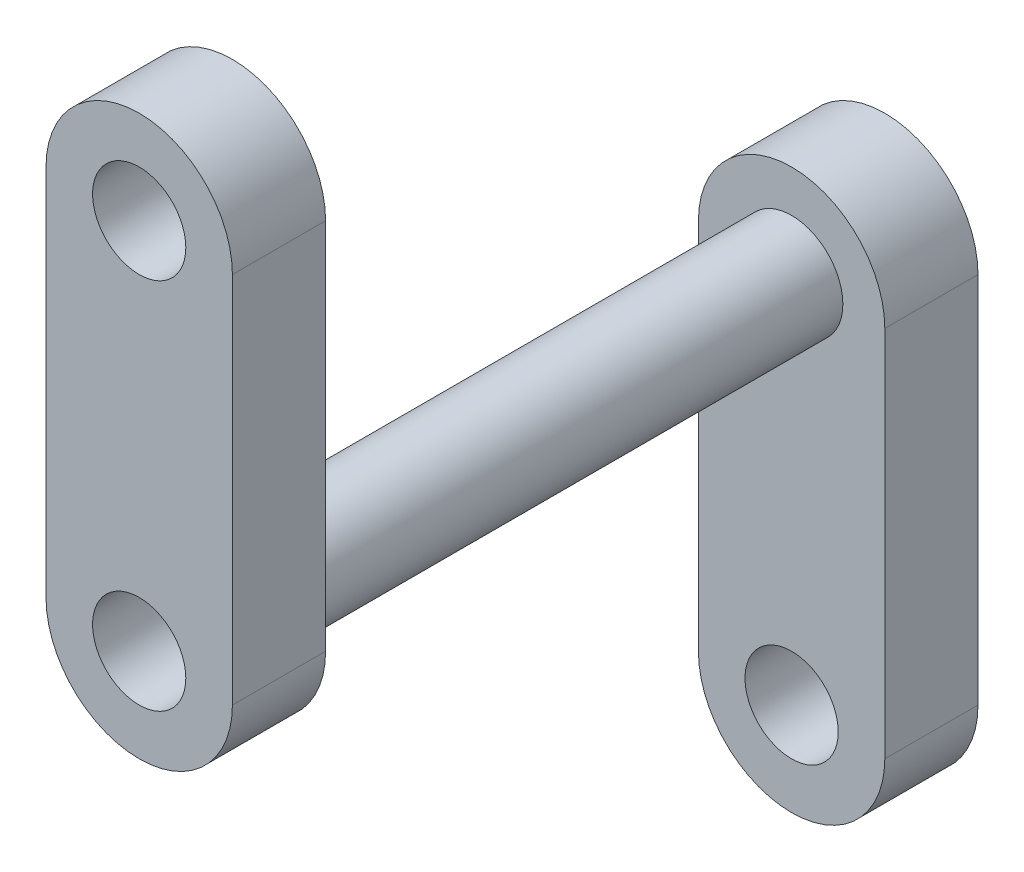
ISO-10303-21;
HEADER;
FILE_DESCRIPTION(('STEP AP214'),'2;1');
FILE_NAME('part.step','',(''),(''),'','','');
FILE_SCHEMA(('AUTOMOTIVE_DESIGN { 1 0 10303 214 1 1 1 1 }'));
ENDSEC;
DATA;
#1=APPLICATION_CONTEXT('core data for automotive mechanical design processes');
#2=APPLICATION_PROTOCOL_DEFINITION('international standard','automotive_design',2000,#1);
#3=PRODUCT_CONTEXT('',#1,'mechanical');
#4=PRODUCT('Part','Part','',(#3));
#5=PRODUCT_RELATED_PRODUCT_CATEGORY('part','',(#4));
#6=PRODUCT_DEFINITION_FORMATION('','',#4);
#7=PRODUCT_DEFINITION_CONTEXT('part definition',#1,'design');
#8=PRODUCT_DEFINITION('design','',#6,#7);
#9=PRODUCT_DEFINITION_SHAPE('','',#8);
#10=(LENGTH_UNIT() NAMED_UNIT(*) SI_UNIT(.MILLI.,.METRE.));
#11=(NAMED_UNIT(*) PLANE_ANGLE_UNIT() SI_UNIT($,.RADIAN.));
#12=(NAMED_UNIT(*) SI_UNIT($,.STERADIAN.) SOLID_ANGLE_UNIT());
#13=UNCERTAINTY_MEASURE_WITH_UNIT(LENGTH_MEASURE(1.E-05),#10,'distance_accuracy_value','');
#14=(GEOMETRIC_REPRESENTATION_CONTEXT(3) GLOBAL_UNCERTAINTY_ASSIGNED_CONTEXT((#13)) GLOBAL_UNIT_ASSIGNED_CONTEXT((#10,
#11,#12)) REPRESENTATION_CONTEXT('',''));
#15=CARTESIAN_POINT('',(0.,0.,0.));
#16=DIRECTION('',(0.,0.,1.));
#17=DIRECTION('',(1.,0.,0.));
#18=AXIS2_PLACEMENT_3D('',#15,#16,#17);
#19=CARTESIAN_POINT('',(10.,50.,80.));
#20=DIRECTION('',(0.,0.,-1.));
#21=DIRECTION('',(-1.,0.,0.));
#22=AXIS2_PLACEMENT_3D('',#19,#20,#21);
#23=CYLINDRICAL_SURFACE('',#22,5.5);
#24=CARTESIAN_POINT('',(10.,50.,10.));
#25=DIRECTION('',(0.,0.,1.));
#26=DIRECTION('',(1.,0.,0.));
#27=AXIS2_PLACEMENT_3D('',#24,#25,#26);
#28=CIRCLE('',#27,5.5);
#29=CARTESIAN_POINT('',(15.5,50.,10.));
#30=VERTEX_POINT('',#29);
#31=EDGE_CURVE('E161',#30,#30,#28,.T.);
#32=ORIENTED_EDGE('',*,*,#31,.T.);
#33=EDGE_LOOP('',(#32));
#34=FACE_BOUND('',#33,.T.);
#35=CARTESIAN_POINT('',(10.,50.,70.));
#36=DIRECTION('',(0.,0.,1.));
#37=DIRECTION('',(1.,0.,0.));
#38=AXIS2_PLACEMENT_3D('',#35,#36,#37);
#39=CIRCLE('',#38,5.5);
#40=CARTESIAN_POINT('',(15.5,50.,70.));
#41=VERTEX_POINT('',#40);
#42=EDGE_CURVE('E11',#41,#41,#39,.T.);
#43=ORIENTED_EDGE('',*,*,#42,.F.);
#44=EDGE_LOOP('',(#43));
#45=FACE_BOUND('',#44,.T.);
#46=ADVANCED_FACE('F35',(#34,#45),#23,.T.);
#47=CARTESIAN_POINT('',(0.,0.,10.));
#48=DIRECTION('',(-1.,0.,0.));
#49=DIRECTION('',(0.,-1.,0.));
#50=AXIS2_PLACEMENT_3D('',#47,#48,#49);
#51=PLANE('',#50);
#52=DIRECTION('',(0.,1.,0.));
#53=VECTOR('',#52,1.);
#54=CARTESIAN_POINT('',(0.,0.,0.));
#55=LINE('',#54,#53);
#56=CARTESIAN_POINT('',(0.,10.,0.));
#57=VERTEX_POINT('',#56);
#58=CARTESIAN_POINT('',(0.,50.,0.));
#59=VERTEX_POINT('',#58);
#60=EDGE_CURVE('E177',#57,#59,#55,.T.);
#61=ORIENTED_EDGE('',*,*,#60,.F.);
#62=DIRECTION('',(0.,0.,-1.));
#63=VECTOR('',#62,1.);
#64=CARTESIAN_POINT('',(0.,10.,10.));
#65=LINE('',#64,#63);
#66=CARTESIAN_POINT('',(0.,10.,10.));
#67=VERTEX_POINT('',#66);
#68=EDGE_CURVE('E44',#67,#57,#65,.T.);
#69=ORIENTED_EDGE('',*,*,#68,.F.);
#70=DIRECTION('',(0.,1.,0.));
#71=VECTOR('',#70,1.);
#72=CARTESIAN_POINT('',(0.,0.,10.));
#73=LINE('',#72,#71);
#74=CARTESIAN_POINT('',(0.,50.,10.));
#75=VERTEX_POINT('',#74);
#76=EDGE_CURVE('E167',#67,#75,#73,.T.);
#77=ORIENTED_EDGE('',*,*,#76,.T.);
#78=DIRECTION('',(0.,0.,-1.));
#79=VECTOR('',#78,1.);
#80=CARTESIAN_POINT('',(0.,50.,10.));
#81=LINE('',#80,#79);
#82=EDGE_CURVE('E76',#75,#59,#81,.T.);
#83=ORIENTED_EDGE('',*,*,#82,.T.);
#84=EDGE_LOOP('',(#61,#69,#77,#83));
#85=FACE_BOUND('',#84,.T.);
#86=ADVANCED_FACE('F197',(#85),#51,.T.);
#87=CARTESIAN_POINT('',(10.,10.,10.));
#88=DIRECTION('',(0.,0.,-1.));
#89=DIRECTION('',(-1.,0.,0.));
#90=AXIS2_PLACEMENT_3D('',#87,#88,#89);
#91=CYLINDRICAL_SURFACE('',#90,10.);
#92=CARTESIAN_POINT('',(10.,10.,0.));
#93=DIRECTION('',(0.,0.,1.));
#94=DIRECTION('',(1.,0.,0.));
#95=AXIS2_PLACEMENT_3D('',#92,#93,#94);
#96=CIRCLE('',#95,10.);
#97=CARTESIAN_POINT('',(20.,10.,0.));
#98=VERTEX_POINT('',#97);
#99=EDGE_CURVE('E179',#57,#98,#96,.T.);
#100=ORIENTED_EDGE('',*,*,#99,.T.);
#101=DIRECTION('',(0.,0.,-1.));
#102=VECTOR('',#101,1.);
#103=CARTESIAN_POINT('',(20.,10.,10.));
#104=LINE('',#103,#102);
#105=CARTESIAN_POINT('',(20.,10.,10.));
#106=VERTEX_POINT('',#105);
#107=EDGE_CURVE('E189',#106,#98,#104,.T.);
#108=ORIENTED_EDGE('',*,*,#107,.F.);
#109=CARTESIAN_POINT('',(10.,10.,10.));
#110=DIRECTION('',(0.,0.,1.));
#111=DIRECTION('',(1.,0.,0.));
#112=AXIS2_PLACEMENT_3D('',#109,#110,#111);
#113=CIRCLE('',#112,10.);
#114=EDGE_CURVE('E169',#67,#106,#113,.T.);
#115=ORIENTED_EDGE('',*,*,#114,.F.);
#116=ORIENTED_EDGE('',*,*,#68,.T.);
#117=EDGE_LOOP('',(#100,#108,#115,#116));
#118=FACE_BOUND('',#117,.T.);
#119=ADVANCED_FACE('F193',(#118),#91,.T.);
#120=CARTESIAN_POINT('',(20.,0.,10.));
#121=DIRECTION('',(-1.,0.,0.));
#122=DIRECTION('',(0.,-1.,0.));
#123=AXIS2_PLACEMENT_3D('',#120,#121,#122);
#124=PLANE('',#123);
#125=DIRECTION('',(0.,1.,0.));
#126=VECTOR('',#125,1.);
#127=CARTESIAN_POINT('',(20.,0.,0.));
#128=LINE('',#127,#126);
#129=CARTESIAN_POINT('',(20.,50.,0.));
#130=VERTEX_POINT('',#129);
#131=EDGE_CURVE('E182',#98,#130,#128,.T.);
#132=ORIENTED_EDGE('',*,*,#131,.T.);
#133=DIRECTION('',(0.,0.,-1.));
#134=VECTOR('',#133,1.);
#135=CARTESIAN_POINT('',(20.,50.,10.));
#136=LINE('',#135,#134);
#137=CARTESIAN_POINT('',(20.,50.,10.));
#138=VERTEX_POINT('',#137);
#139=EDGE_CURVE('E187',#138,#130,#136,.T.);
#140=ORIENTED_EDGE('',*,*,#139,.F.);
#141=DIRECTION('',(0.,1.,0.));
#142=VECTOR('',#141,1.);
#143=CARTESIAN_POINT('',(20.,0.,10.));
#144=LINE('',#143,#142);
#145=EDGE_CURVE('E172',#106,#138,#144,.T.);
#146=ORIENTED_EDGE('',*,*,#145,.F.);
#147=ORIENTED_EDGE('',*,*,#107,.T.);
#148=EDGE_LOOP('',(#132,#140,#146,#147));
#149=FACE_BOUND('',#148,.T.);
#150=ADVANCED_FACE('F203',(#149),#124,.F.);
#151=CARTESIAN_POINT('',(10.,10.,10.));
#152=DIRECTION('',(0.,0.,-1.));
#153=DIRECTION('',(-1.,0.,0.));
#154=AXIS2_PLACEMENT_3D('',#151,#152,#153);
#155=CYLINDRICAL_SURFACE('',#154,5.);
#156=CARTESIAN_POINT('',(10.,10.,10.));
#157=DIRECTION('',(0.,0.,1.));
#158=DIRECTION('',(1.,0.,0.));
#159=AXIS2_PLACEMENT_3D('',#156,#157,#158);
#160=CIRCLE('',#159,5.);
#161=CARTESIAN_POINT('',(15.,10.,10.));
#162=VERTEX_POINT('',#161);
#163=EDGE_CURVE('E164',#162,#162,#160,.T.);
#164=ORIENTED_EDGE('',*,*,#163,.T.);
#165=EDGE_LOOP('',(#164));
#166=FACE_BOUND('',#165,.T.);
#167=CARTESIAN_POINT('',(10.,10.,0.));
#168=DIRECTION('',(0.,0.,1.));
#169=DIRECTION('',(1.,0.,0.));
#170=AXIS2_PLACEMENT_3D('',#167,#168,#169);
#171=CIRCLE('',#170,5.);
#172=CARTESIAN_POINT('',(15.,10.,0.));
#173=VERTEX_POINT('',#172);
#174=EDGE_CURVE('E158',#173,#173,#171,.T.);
#175=ORIENTED_EDGE('',*,*,#174,.F.);
#176=EDGE_LOOP('',(#175));
#177=FACE_BOUND('',#176,.T.);
#178=ADVANCED_FACE('F37',(#166,#177),#155,.F.);
#179=CARTESIAN_POINT('',(10.,50.,10.));
#180=DIRECTION('',(0.,0.,-1.));
#181=DIRECTION('',(-1.,0.,0.));
#182=AXIS2_PLACEMENT_3D('',#179,#180,#181);
#183=CYLINDRICAL_SURFACE('',#182,10.);
#184=CARTESIAN_POINT('',(10.,50.,0.));
#185=DIRECTION('',(0.,0.,1.));
#186=DIRECTION('',(1.,0.,0.));
#187=AXIS2_PLACEMENT_3D('',#184,#185,#186);
#188=CIRCLE('',#187,10.);
#189=EDGE_CURVE('E69',#130,#59,#188,.T.);
#190=ORIENTED_EDGE('',*,*,#189,.T.);
#191=ORIENTED_EDGE('',*,*,#82,.F.);
#192=CARTESIAN_POINT('',(10.,50.,10.));
#193=DIRECTION('',(0.,0.,1.));
#194=DIRECTION('',(1.,0.,0.));
#195=AXIS2_PLACEMENT_3D('',#192,#193,#194);
#196=CIRCLE('',#195,10.);
#197=EDGE_CURVE('E52',#138,#75,#196,.T.);
#198=ORIENTED_EDGE('',*,*,#197,.F.);
#199=ORIENTED_EDGE('',*,*,#139,.T.);
#200=EDGE_LOOP('',(#190,#191,#198,#199));
#201=FACE_BOUND('',#200,.T.);
#202=ADVANCED_FACE('F211',(#201),#183,.T.);
#203=CARTESIAN_POINT('',(0.,0.,10.));
#204=DIRECTION('',(0.,0.,1.));
#205=DIRECTION('',(1.,0.,0.));
#206=AXIS2_PLACEMENT_3D('',#203,#204,#205);
#207=PLANE('',#206);
#208=ORIENTED_EDGE('',*,*,#31,.F.);
#209=EDGE_LOOP('',(#208));
#210=FACE_BOUND('',#209,.T.);
#211=ORIENTED_EDGE('',*,*,#163,.F.);
#212=EDGE_LOOP('',(#211));
#213=FACE_BOUND('',#212,.T.);
#214=ORIENTED_EDGE('',*,*,#76,.F.);
#215=ORIENTED_EDGE('',*,*,#114,.T.);
#216=ORIENTED_EDGE('',*,*,#145,.T.);
#217=ORIENTED_EDGE('',*,*,#197,.T.);
#218=EDGE_LOOP('',(#214,#215,#216,#217));
#219=FACE_BOUND('',#218,.T.);
#220=ADVANCED_FACE('F214',(#210,#213,#219),#207,.T.);
#221=CARTESIAN_POINT('',(0.,0.,0.));
#222=DIRECTION('',(0.,0.,1.));
#223=DIRECTION('',(1.,0.,0.));
#224=AXIS2_PLACEMENT_3D('',#221,#222,#223);
#225=PLANE('',#224);
#226=ORIENTED_EDGE('',*,*,#174,.T.);
#227=EDGE_LOOP('',(#226));
#228=FACE_BOUND('',#227,.T.);
#229=ORIENTED_EDGE('',*,*,#60,.T.);
#230=ORIENTED_EDGE('',*,*,#189,.F.);
#231=ORIENTED_EDGE('',*,*,#131,.F.);
#232=ORIENTED_EDGE('',*,*,#99,.F.);
#233=EDGE_LOOP('',(#229,#230,#231,#232));
#234=FACE_BOUND('',#233,.T.);
#235=CARTESIAN_POINT('',(10.,50.,0.));
#236=DIRECTION('',(0.,0.,1.));
#237=DIRECTION('',(1.,0.,0.));
#238=AXIS2_PLACEMENT_3D('',#235,#236,#237);
#239=CIRCLE('',#238,5.);
#240=CARTESIAN_POINT('',(15.,50.,0.));
#241=VERTEX_POINT('',#240);
#242=EDGE_CURVE('E151',#241,#241,#239,.T.);
#243=ORIENTED_EDGE('',*,*,#242,.T.);
#244=EDGE_LOOP('',(#243));
#245=FACE_BOUND('',#244,.T.);
#246=ADVANCED_FACE('F195',(#228,#234,#245),#225,.F.);
#247=CARTESIAN_POINT('',(10.,50.,80.));
#248=DIRECTION('',(0.,0.,-1.));
#249=DIRECTION('',(-1.,0.,0.));
#250=AXIS2_PLACEMENT_3D('',#247,#248,#249);
#251=CYLINDRICAL_SURFACE('',#250,5.);
#252=CARTESIAN_POINT('',(10.,50.,80.));
#253=DIRECTION('',(0.,0.,1.));
#254=DIRECTION('',(1.,0.,0.));
#255=AXIS2_PLACEMENT_3D('',#252,#253,#254);
#256=CIRCLE('',#255,5.);
#257=CARTESIAN_POINT('',(15.,50.,80.));
#258=VERTEX_POINT('',#257);
#259=EDGE_CURVE('E155',#258,#258,#256,.T.);
#260=ORIENTED_EDGE('',*,*,#259,.T.);
#261=EDGE_LOOP('',(#260));
#262=FACE_BOUND('',#261,.T.);
#263=ORIENTED_EDGE('',*,*,#242,.F.);
#264=EDGE_LOOP('',(#263));
#265=FACE_BOUND('',#264,.T.);
#266=ADVANCED_FACE('F218',(#262,#265),#251,.F.);
#267=CARTESIAN_POINT('',(0.,0.,80.));
#268=DIRECTION('',(0.,0.,1.));
#269=DIRECTION('',(1.,0.,0.));
#270=AXIS2_PLACEMENT_3D('',#267,#268,#269);
#271=PLANE('',#270);
#272=ORIENTED_EDGE('',*,*,#259,.F.);
#273=EDGE_LOOP('',(#272));
#274=FACE_BOUND('',#273,.T.);
#275=CARTESIAN_POINT('',(9.99999999999972,90.,80.));
#276=DIRECTION('',(0.,0.,1.));
#277=DIRECTION('',(1.,0.,0.));
#278=AXIS2_PLACEMENT_3D('',#275,#276,#277);
#279=CIRCLE('',#278,5.00000000000001);
#280=CARTESIAN_POINT('',(14.9999999999997,90.,80.));
#281=VERTEX_POINT('',#280);
#282=EDGE_CURVE('E138',#281,#281,#279,.T.);
#283=ORIENTED_EDGE('',*,*,#282,.F.);
#284=EDGE_LOOP('',(#283));
#285=FACE_BOUND('',#284,.T.);
#286=DIRECTION('',(0.,-1.,0.));
#287=VECTOR('',#286,1.);
#288=CARTESIAN_POINT('',(20.0000000000004,1.40512601554124E-13,80.));
#289=LINE('',#288,#287);
#290=CARTESIAN_POINT('',(19.9999999999997,90.0000000000001,80.));
#291=VERTEX_POINT('',#290);
#292=CARTESIAN_POINT('',(20.,50.0000000000001,80.));
#293=VERTEX_POINT('',#292);
#294=EDGE_CURVE('E141',#291,#293,#289,.T.);
#295=ORIENTED_EDGE('',*,*,#294,.F.);
#296=CARTESIAN_POINT('',(9.99999999999972,90.,80.));
#297=DIRECTION('',(0.,0.,1.));
#298=DIRECTION('',(1.,0.,0.));
#299=AXIS2_PLACEMENT_3D('',#296,#297,#298);
#300=CIRCLE('',#299,10.);
#301=CARTESIAN_POINT('',(-2.80157841370254E-13,89.9999999999999,80.));
#302=VERTEX_POINT('',#301);
#303=EDGE_CURVE('E113',#291,#302,#300,.T.);
#304=ORIENTED_EDGE('',*,*,#303,.T.);
#305=DIRECTION('',(0.,-1.,0.));
#306=VECTOR('',#305,1.);
#307=CARTESIAN_POINT('',(3.365363543395E-13,0.,80.));
#308=LINE('',#307,#306);
#309=CARTESIAN_POINT('',(0.,49.9999999999999,80.));
#310=VERTEX_POINT('',#309);
#311=EDGE_CURVE('E144',#302,#310,#308,.T.);
#312=ORIENTED_EDGE('',*,*,#311,.T.);
#313=CARTESIAN_POINT('',(10.,50.,80.));
#314=DIRECTION('',(0.,0.,1.));
#315=DIRECTION('',(1.,0.,0.));
#316=AXIS2_PLACEMENT_3D('',#313,#314,#315);
#317=CIRCLE('',#316,10.);
#318=EDGE_CURVE('E147',#310,#293,#317,.T.);
#319=ORIENTED_EDGE('',*,*,#318,.T.);
#320=EDGE_LOOP('',(#295,#304,#312,#319));
#321=FACE_BOUND('',#320,.T.);
#322=ADVANCED_FACE('F224',(#274,#285,#321),#271,.T.);
#323=CARTESIAN_POINT('',(20.0000000000004,1.40512601554124E-13,70.));
#324=DIRECTION('',(-1.,0.,0.));
#325=DIRECTION('',(0.,-1.,0.));
#326=AXIS2_PLACEMENT_3D('',#323,#324,#325);
#327=PLANE('',#326);
#328=ORIENTED_EDGE('',*,*,#294,.T.);
#329=DIRECTION('',(0.,0.,1.));
#330=VECTOR('',#329,1.);
#331=CARTESIAN_POINT('',(20.,50.0000000000001,70.));
#332=LINE('',#331,#330);
#333=CARTESIAN_POINT('',(20.,50.0000000000001,70.));
#334=VERTEX_POINT('',#333);
#335=EDGE_CURVE('E123',#334,#293,#332,.T.);
#336=ORIENTED_EDGE('',*,*,#335,.F.);
#337=DIRECTION('',(0.,-1.,0.));
#338=VECTOR('',#337,1.);
#339=CARTESIAN_POINT('',(20.0000000000004,1.40512601554124E-13,70.));
#340=LINE('',#339,#338);
#341=CARTESIAN_POINT('',(19.9999999999997,90.0000000000001,70.));
#342=VERTEX_POINT('',#341);
#343=EDGE_CURVE('E121',#342,#334,#340,.T.);
#344=ORIENTED_EDGE('',*,*,#343,.F.);
#345=DIRECTION('',(0.,0.,1.));
#346=VECTOR('',#345,1.);
#347=CARTESIAN_POINT('',(19.9999999999997,90.0000000000001,70.));
#348=LINE('',#347,#346);
#349=EDGE_CURVE('E107',#342,#291,#348,.T.);
#350=ORIENTED_EDGE('',*,*,#349,.T.);
#351=EDGE_LOOP('',(#328,#336,#344,#350));
#352=FACE_BOUND('',#351,.T.);
#353=ADVANCED_FACE('F122',(#352),#327,.F.);
#354=CARTESIAN_POINT('',(10.,50.,70.));
#355=DIRECTION('',(0.,0.,1.));
#356=DIRECTION('',(1.,0.,0.));
#357=AXIS2_PLACEMENT_3D('',#354,#355,#356);
#358=CYLINDRICAL_SURFACE('',#357,10.);
#359=ORIENTED_EDGE('',*,*,#318,.F.);
#360=DIRECTION('',(0.,0.,1.));
#361=VECTOR('',#360,1.);
#362=CARTESIAN_POINT('',(0.,49.9999999999999,70.));
#363=LINE('',#362,#361);
#364=CARTESIAN_POINT('',(0.,49.9999999999999,70.));
#365=VERTEX_POINT('',#364);
#366=EDGE_CURVE('E152',#365,#310,#363,.T.);
#367=ORIENTED_EDGE('',*,*,#366,.F.);
#368=CARTESIAN_POINT('',(10.,50.,70.));
#369=DIRECTION('',(0.,0.,1.));
#370=DIRECTION('',(1.,0.,0.));
#371=AXIS2_PLACEMENT_3D('',#368,#369,#370);
#372=CIRCLE('',#371,10.);
#373=EDGE_CURVE('E118',#365,#334,#372,.T.);
#374=ORIENTED_EDGE('',*,*,#373,.T.);
#375=ORIENTED_EDGE('',*,*,#335,.T.);
#376=EDGE_LOOP('',(#359,#367,#374,#375));
#377=FACE_BOUND('',#376,.T.);
#378=ADVANCED_FACE('F237',(#377),#358,.T.);
#379=CARTESIAN_POINT('',(3.365363543395E-13,0.,70.));
#380=DIRECTION('',(-1.,0.,0.));
#381=DIRECTION('',(0.,-1.,0.));
#382=AXIS2_PLACEMENT_3D('',#379,#380,#381);
#383=PLANE('',#382);
#384=ORIENTED_EDGE('',*,*,#311,.F.);
#385=DIRECTION('',(0.,0.,1.));
#386=VECTOR('',#385,1.);
#387=CARTESIAN_POINT('',(-2.80157841370254E-13,89.9999999999999,70.));
#388=LINE('',#387,#386);
#389=CARTESIAN_POINT('',(-2.80157841370254E-13,89.9999999999999,70.));
#390=VERTEX_POINT('',#389);
#391=EDGE_CURVE('E117',#390,#302,#388,.T.);
#392=ORIENTED_EDGE('',*,*,#391,.F.);
#393=DIRECTION('',(0.,-1.,0.));
#394=VECTOR('',#393,1.);
#395=CARTESIAN_POINT('',(3.365363543395E-13,0.,70.));
#396=LINE('',#395,#394);
#397=EDGE_CURVE('E132',#390,#365,#396,.T.);
#398=ORIENTED_EDGE('',*,*,#397,.T.);
#399=ORIENTED_EDGE('',*,*,#366,.T.);
#400=EDGE_LOOP('',(#384,#392,#398,#399));
#401=FACE_BOUND('',#400,.T.);
#402=ADVANCED_FACE('F233',(#401),#383,.T.);
#403=CARTESIAN_POINT('',(9.99999999999972,90.,70.));
#404=DIRECTION('',(0.,0.,1.));
#405=DIRECTION('',(1.,0.,0.));
#406=AXIS2_PLACEMENT_3D('',#403,#404,#405);
#407=CYLINDRICAL_SURFACE('',#406,5.00000000000001);
#408=CARTESIAN_POINT('',(9.99999999999972,90.,70.));
#409=DIRECTION('',(0.,0.,1.));
#410=DIRECTION('',(1.,0.,0.));
#411=AXIS2_PLACEMENT_3D('',#408,#409,#410);
#412=CIRCLE('',#411,5.00000000000001);
#413=CARTESIAN_POINT('',(14.9999999999997,90.,70.));
#414=VERTEX_POINT('',#413);
#415=EDGE_CURVE('E127',#414,#414,#412,.T.);
#416=ORIENTED_EDGE('',*,*,#415,.F.);
#417=EDGE_LOOP('',(#416));
#418=FACE_BOUND('',#417,.T.);
#419=ORIENTED_EDGE('',*,*,#282,.T.);
#420=EDGE_LOOP('',(#419));
#421=FACE_BOUND('',#420,.T.);
#422=ADVANCED_FACE('F230',(#418,#421),#407,.F.);
#423=CARTESIAN_POINT('',(9.99999999999972,90.,70.));
#424=DIRECTION('',(0.,0.,1.));
#425=DIRECTION('',(1.,0.,0.));
#426=AXIS2_PLACEMENT_3D('',#423,#424,#425);
#427=CYLINDRICAL_SURFACE('',#426,10.);
#428=ORIENTED_EDGE('',*,*,#303,.F.);
#429=ORIENTED_EDGE('',*,*,#349,.F.);
#430=CARTESIAN_POINT('',(9.99999999999972,90.,70.));
#431=DIRECTION('',(0.,0.,1.));
#432=DIRECTION('',(1.,0.,0.));
#433=AXIS2_PLACEMENT_3D('',#430,#431,#432);
#434=CIRCLE('',#433,10.);
#435=EDGE_CURVE('E111',#342,#390,#434,.T.);
#436=ORIENTED_EDGE('',*,*,#435,.T.);
#437=ORIENTED_EDGE('',*,*,#391,.T.);
#438=EDGE_LOOP('',(#428,#429,#436,#437));
#439=FACE_BOUND('',#438,.T.);
#440=ADVANCED_FACE('F109',(#439),#427,.T.);
#441=CARTESIAN_POINT('',(0.,0.,70.));
#442=DIRECTION('',(0.,0.,1.));
#443=DIRECTION('',(1.,0.,0.));
#444=AXIS2_PLACEMENT_3D('',#441,#442,#443);
#445=PLANE('',#444);
#446=ORIENTED_EDGE('',*,*,#42,.T.);
#447=EDGE_LOOP('',(#446));
#448=FACE_BOUND('',#447,.T.);
#449=ORIENTED_EDGE('',*,*,#415,.T.);
#450=EDGE_LOOP('',(#449));
#451=FACE_BOUND('',#450,.T.);
#452=ORIENTED_EDGE('',*,*,#343,.T.);
#453=ORIENTED_EDGE('',*,*,#373,.F.);
#454=ORIENTED_EDGE('',*,*,#397,.F.);
#455=ORIENTED_EDGE('',*,*,#435,.F.);
#456=EDGE_LOOP('',(#452,#453,#454,#455));
#457=FACE_BOUND('',#456,.T.);
#458=ADVANCED_FACE('F130',(#448,#451,#457),#445,.F.);
#459=CLOSED_SHELL('',(#46,#86,#119,#150,#178,#202,#220,#246,#266,#322,#353,#378,#402,#422,#440,#458));
#460=MANIFOLD_SOLID_BREP('B2',#459);
#461=ADVANCED_BREP_SHAPE_REPRESENTATION('',(#18,#460),#14);
#462=SHAPE_DEFINITION_REPRESENTATION(#9,#461);
ENDSEC;
END-ISO-10303-21;
